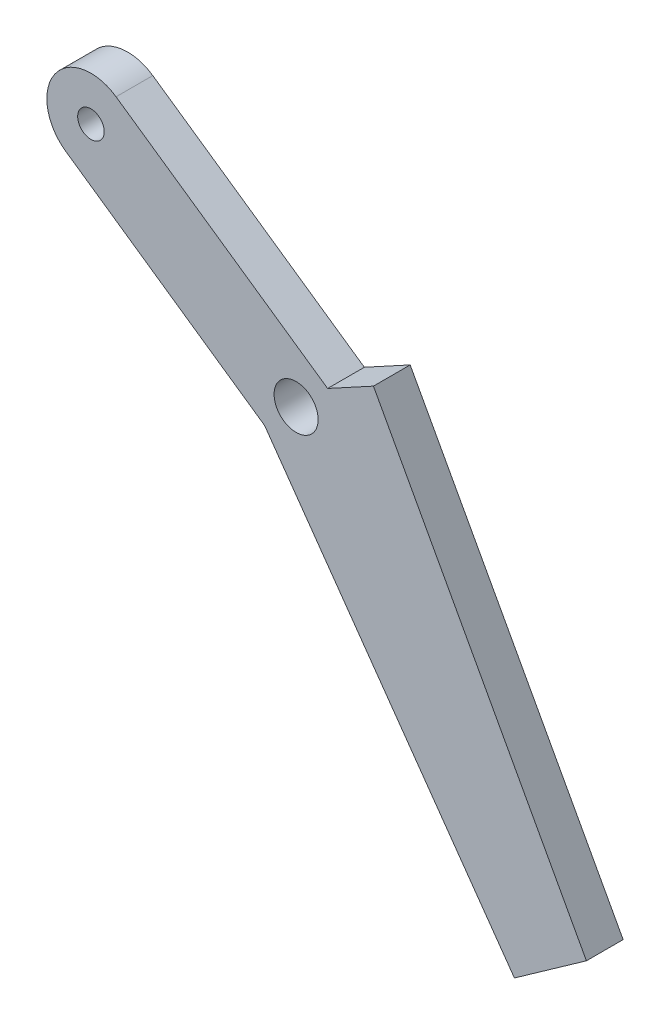
ISO-10303-21;
HEADER;
FILE_DESCRIPTION(('STEP AP214'),'2;1');
FILE_NAME('part.step','',(''),(''),'','','');
FILE_SCHEMA(('AUTOMOTIVE_DESIGN { 1 0 10303 214 1 1 1 1 }'));
ENDSEC;
DATA;
#1=APPLICATION_CONTEXT('core data for automotive mechanical design processes');
#2=APPLICATION_PROTOCOL_DEFINITION('international standard','automotive_design',2000,#1);
#3=PRODUCT_CONTEXT('',#1,'mechanical');
#4=PRODUCT('Part','Part','',(#3));
#5=PRODUCT_RELATED_PRODUCT_CATEGORY('part','',(#4));
#6=PRODUCT_DEFINITION_FORMATION('','',#4);
#7=PRODUCT_DEFINITION_CONTEXT('part definition',#1,'design');
#8=PRODUCT_DEFINITION('design','',#6,#7);
#9=PRODUCT_DEFINITION_SHAPE('','',#8);
#10=(LENGTH_UNIT() NAMED_UNIT(*) SI_UNIT(.MILLI.,.METRE.));
#11=(NAMED_UNIT(*) PLANE_ANGLE_UNIT() SI_UNIT($,.RADIAN.));
#12=(NAMED_UNIT(*) SI_UNIT($,.STERADIAN.) SOLID_ANGLE_UNIT());
#13=UNCERTAINTY_MEASURE_WITH_UNIT(LENGTH_MEASURE(1.E-05),#10,'distance_accuracy_value','');
#14=(GEOMETRIC_REPRESENTATION_CONTEXT(3) GLOBAL_UNCERTAINTY_ASSIGNED_CONTEXT((#13)) GLOBAL_UNIT_ASSIGNED_CONTEXT((#10,
#11,#12)) REPRESENTATION_CONTEXT('',''));
#15=CARTESIAN_POINT('',(0.,0.,0.));
#16=DIRECTION('',(0.,0.,1.));
#17=DIRECTION('',(1.,0.,0.));
#18=AXIS2_PLACEMENT_3D('',#15,#16,#17);
#19=CARTESIAN_POINT('',(36.7403272001533,52.945063432731,-2.5));
#20=DIRECTION('',(0.570112302985173,0.821566772687979,0.));
#21=DIRECTION('',(-0.821566772687979,0.570112302985173,0.));
#22=AXIS2_PLACEMENT_3D('',#19,#20,#21);
#23=PLANE('',#22);
#24=DIRECTION('',(0.821566772687979,-0.570112302985173,0.));
#25=VECTOR('',#24,1.);
#26=CARTESIAN_POINT('',(36.7403272001533,52.945063432731,0.));
#27=LINE('',#26,#25);
#28=CARTESIAN_POINT('',(176.598168195802,-44.1069090559931,0.));
#29=VERTEX_POINT('',#28);
#30=CARTESIAN_POINT('',(190.999396496933,-54.1003967498914,0.));
#31=VERTEX_POINT('',#30);
#32=EDGE_CURVE('E132',#29,#31,#27,.T.);
#33=ORIENTED_EDGE('',*,*,#32,.T.);
#34=DIRECTION('',(0.,0.,1.));
#35=VECTOR('',#34,1.);
#36=CARTESIAN_POINT('',(190.999396496933,-54.1003967498914,-2.5));
#37=LINE('',#36,#35);
#38=CARTESIAN_POINT('',(190.999396496933,-54.1003967498914,-2.5));
#39=VERTEX_POINT('',#38);
#40=EDGE_CURVE('E128',#39,#31,#37,.T.);
#41=ORIENTED_EDGE('',*,*,#40,.F.);
#42=DIRECTION('',(0.821566772687979,-0.570112302985173,0.));
#43=VECTOR('',#42,1.);
#44=CARTESIAN_POINT('',(36.7403272001533,52.945063432731,-2.5));
#45=LINE('',#44,#43);
#46=CARTESIAN_POINT('',(176.598168195802,-44.1069090559931,-2.5));
#47=VERTEX_POINT('',#46);
#48=EDGE_CURVE('E168',#47,#39,#45,.T.);
#49=ORIENTED_EDGE('',*,*,#48,.F.);
#50=DIRECTION('',(0.,0.,1.));
#51=VECTOR('',#50,1.);
#52=CARTESIAN_POINT('',(176.598168195802,-44.1069090559931,-2.5));
#53=LINE('',#52,#51);
#54=EDGE_CURVE('E11',#47,#29,#53,.T.);
#55=ORIENTED_EDGE('',*,*,#54,.T.);
#56=EDGE_LOOP('',(#33,#41,#49,#55));
#57=FACE_BOUND('',#56,.T.);
#58=ADVANCED_FACE('F34',(#57),#23,.T.);
#59=CARTESIAN_POINT('',(174.887831286847,-46.571609374057,-2.5));
#60=DIRECTION('',(0.,0.,1.));
#61=DIRECTION('',(-1.,0.,0.));
#62=AXIS2_PLACEMENT_3D('',#59,#60,#61);
#63=CYLINDRICAL_SURFACE('',#62,2.99999999999999);
#64=CARTESIAN_POINT('',(174.887831286847,-46.571609374057,0.));
#65=DIRECTION('',(0.,0.,1.));
#66=DIRECTION('',(1.,0.,0.));
#67=AXIS2_PLACEMENT_3D('',#64,#65,#66);
#68=CIRCLE('',#67,2.99999999999999);
#69=CARTESIAN_POINT('',(173.177494377891,-49.036309692121,0.));
#70=VERTEX_POINT('',#69);
#71=EDGE_CURVE('E135',#29,#70,#68,.T.);
#72=ORIENTED_EDGE('',*,*,#71,.F.);
#73=ORIENTED_EDGE('',*,*,#54,.F.);
#74=CARTESIAN_POINT('',(174.887831286847,-46.571609374057,-2.5));
#75=DIRECTION('',(0.,0.,1.));
#76=DIRECTION('',(1.,0.,0.));
#77=AXIS2_PLACEMENT_3D('',#74,#75,#76);
#78=CIRCLE('',#77,2.99999999999999);
#79=CARTESIAN_POINT('',(173.177494377891,-49.036309692121,-2.5));
#80=VERTEX_POINT('',#79);
#81=EDGE_CURVE('E86',#47,#80,#78,.T.);
#82=ORIENTED_EDGE('',*,*,#81,.T.);
#83=DIRECTION('',(0.,0.,1.));
#84=VECTOR('',#83,1.);
#85=CARTESIAN_POINT('',(173.177494377891,-49.036309692121,-2.5));
#86=LINE('',#85,#84);
#87=EDGE_CURVE('E43',#80,#70,#86,.T.);
#88=ORIENTED_EDGE('',*,*,#87,.T.);
#89=EDGE_LOOP('',(#72,#73,#82,#88));
#90=FACE_BOUND('',#89,.T.);
#91=ADVANCED_FACE('F160',(#90),#63,.T.);
#92=CARTESIAN_POINT('',(33.3196533822423,48.0156627966031,-2.5));
#93=DIRECTION('',(0.570112302985173,0.821566772687979,0.));
#94=DIRECTION('',(-0.821566772687979,0.570112302985173,0.));
#95=AXIS2_PLACEMENT_3D('',#92,#93,#94);
#96=PLANE('',#95);
#97=DIRECTION('',(0.82156677268798,-0.570112302985173,0.));
#98=VECTOR('',#97,1.);
#99=CARTESIAN_POINT('',(33.3196533822423,48.0156627966031,0.));
#100=LINE('',#99,#98);
#101=CARTESIAN_POINT('',(186.709536348152,-58.4266402997185,0.));
#102=VERTEX_POINT('',#101);
#103=EDGE_CURVE('E138',#70,#102,#100,.T.);
#104=ORIENTED_EDGE('',*,*,#103,.F.);
#105=ORIENTED_EDGE('',*,*,#87,.F.);
#106=DIRECTION('',(0.82156677268798,-0.570112302985173,0.));
#107=VECTOR('',#106,1.);
#108=CARTESIAN_POINT('',(33.3196533822423,48.0156627966031,-2.5));
#109=LINE('',#108,#107);
#110=CARTESIAN_POINT('',(186.709536348152,-58.4266402997185,-2.5));
#111=VERTEX_POINT('',#110);
#112=EDGE_CURVE('E120',#80,#111,#109,.T.);
#113=ORIENTED_EDGE('',*,*,#112,.T.);
#114=DIRECTION('',(0.,0.,1.));
#115=VECTOR('',#114,1.);
#116=CARTESIAN_POINT('',(186.709536348152,-58.4266402997185,-2.5));
#117=LINE('',#116,#115);
#118=EDGE_CURVE('E155',#111,#102,#117,.T.);
#119=ORIENTED_EDGE('',*,*,#118,.T.);
#120=EDGE_LOOP('',(#104,#105,#113,#119));
#121=FACE_BOUND('',#120,.T.);
#122=ADVANCED_FACE('F173',(#121),#96,.F.);
#123=CARTESIAN_POINT('',(97.0070354424607,68.5373410183082,-2.5));
#124=DIRECTION('',(0.816722709480777,0.577030342199072,0.));
#125=DIRECTION('',(-0.577030342199072,0.816722709480777,0.));
#126=AXIS2_PLACEMENT_3D('',#123,#124,#125);
#127=PLANE('',#126);
#128=DIRECTION('',(0.577030342199073,-0.816722709480777,0.));
#129=VECTOR('',#128,1.);
#130=CARTESIAN_POINT('',(97.0070354424607,68.5373410183082,0.));
#131=LINE('',#130,#129);
#132=CARTESIAN_POINT('',(203.715208560072,-82.4962908358255,0.));
#133=VERTEX_POINT('',#132);
#134=EDGE_CURVE('E141',#102,#133,#131,.T.);
#135=ORIENTED_EDGE('',*,*,#134,.F.);
#136=ORIENTED_EDGE('',*,*,#118,.F.);
#137=DIRECTION('',(0.577030342199073,-0.816722709480777,0.));
#138=VECTOR('',#137,1.);
#139=CARTESIAN_POINT('',(97.0070354424607,68.5373410183082,-2.5));
#140=LINE('',#139,#138);
#141=CARTESIAN_POINT('',(203.715208560072,-82.4962908358255,-2.5));
#142=VERTEX_POINT('',#141);
#143=EDGE_CURVE('E118',#111,#142,#140,.T.);
#144=ORIENTED_EDGE('',*,*,#143,.T.);
#145=DIRECTION('',(0.,0.,1.));
#146=VECTOR('',#145,1.);
#147=CARTESIAN_POINT('',(203.715208560072,-82.4962908358255,-2.5));
#148=LINE('',#147,#146);
#149=EDGE_CURVE('E112',#142,#133,#148,.T.);
#150=ORIENTED_EDGE('',*,*,#149,.T.);
#151=EDGE_LOOP('',(#135,#136,#144,#150));
#152=FACE_BOUND('',#151,.T.);
#153=ADVANCED_FACE('F176',(#152),#127,.F.);
#154=CARTESIAN_POINT('',(106.708173117611,-151.033631854134,-2.5));
#155=DIRECTION('',(-0.57703034219907,0.816722709480779,0.));
#156=DIRECTION('',(-0.816722709480779,-0.57703034219907,0.));
#157=AXIS2_PLACEMENT_3D('',#154,#155,#156);
#158=PLANE('',#157);
#159=DIRECTION('',(0.816722709480779,0.57703034219907,0.));
#160=VECTOR('',#159,1.);
#161=CARTESIAN_POINT('',(106.708173117611,-151.033631854134,0.));
#162=LINE('',#161,#160);
#163=CARTESIAN_POINT('',(208.615544816957,-79.0341087826311,0.));
#164=VERTEX_POINT('',#163);
#165=EDGE_CURVE('E144',#133,#164,#162,.T.);
#166=ORIENTED_EDGE('',*,*,#165,.F.);
#167=ORIENTED_EDGE('',*,*,#149,.F.);
#168=DIRECTION('',(0.816722709480779,0.57703034219907,0.));
#169=VECTOR('',#168,1.);
#170=CARTESIAN_POINT('',(106.708173117611,-151.033631854134,-2.5));
#171=LINE('',#170,#169);
#172=CARTESIAN_POINT('',(208.615544816957,-79.0341087826311,-2.5));
#173=VERTEX_POINT('',#172);
#174=EDGE_CURVE('E102',#142,#173,#171,.T.);
#175=ORIENTED_EDGE('',*,*,#174,.T.);
#176=DIRECTION('',(0.,0.,1.));
#177=VECTOR('',#176,1.);
#178=CARTESIAN_POINT('',(208.615544816957,-79.0341087826311,-2.5));
#179=LINE('',#178,#177);
#180=EDGE_CURVE('E107',#173,#164,#179,.T.);
#181=ORIENTED_EDGE('',*,*,#180,.T.);
#182=EDGE_LOOP('',(#166,#167,#175,#181));
#183=FACE_BOUND('',#182,.T.);
#184=ADVANCED_FACE('F115',(#183),#158,.F.);
#185=CARTESIAN_POINT('',(127.740995685432,69.5361116307564,-2.5));
#186=DIRECTION('',(-0.878302210072713,-0.478105875075163,0.));
#187=DIRECTION('',(0.478105875075163,-0.878302210072713,0.));
#188=AXIS2_PLACEMENT_3D('',#185,#186,#187);
#189=PLANE('',#188);
#190=DIRECTION('',(-0.478105875075163,0.878302210072713,0.));
#191=VECTOR('',#190,1.);
#192=CARTESIAN_POINT('',(127.740995685432,69.5361116307564,0.));
#193=LINE('',#192,#191);
#194=CARTESIAN_POINT('',(194.118553111525,-52.4024765060244,0.));
#195=VERTEX_POINT('',#194);
#196=EDGE_CURVE('E109',#164,#195,#193,.T.);
#197=ORIENTED_EDGE('',*,*,#196,.F.);
#198=ORIENTED_EDGE('',*,*,#180,.F.);
#199=DIRECTION('',(-0.478105875075163,0.878302210072713,0.));
#200=VECTOR('',#199,1.);
#201=CARTESIAN_POINT('',(127.740995685432,69.5361116307564,-2.5));
#202=LINE('',#201,#200);
#203=CARTESIAN_POINT('',(194.118553111525,-52.4024765060244,-2.5));
#204=VERTEX_POINT('',#203);
#205=EDGE_CURVE('E97',#173,#204,#202,.T.);
#206=ORIENTED_EDGE('',*,*,#205,.T.);
#207=DIRECTION('',(0.,0.,1.));
#208=VECTOR('',#207,1.);
#209=CARTESIAN_POINT('',(194.118553111525,-52.4024765060244,-2.5));
#210=LINE('',#209,#208);
#211=EDGE_CURVE('E113',#204,#195,#210,.T.);
#212=ORIENTED_EDGE('',*,*,#211,.T.);
#213=EDGE_LOOP('',(#197,#198,#206,#212));
#214=FACE_BOUND('',#213,.T.);
#215=ADVANCED_FACE('F108',(#214),#189,.F.);
#216=CARTESIAN_POINT('',(66.3775574260927,-121.938588136781,-2.5));
#217=DIRECTION('',(-0.478105875075164,0.878302210072713,0.));
#218=DIRECTION('',(-0.878302210072713,-0.478105875075164,0.));
#219=AXIS2_PLACEMENT_3D('',#216,#217,#218);
#220=PLANE('',#219);
#221=DIRECTION('',(0.878302210072713,0.478105875075164,0.));
#222=VECTOR('',#221,1.);
#223=CARTESIAN_POINT('',(66.3775574260927,-121.938588136781,0.));
#224=LINE('',#223,#222);
#225=EDGE_CURVE('E74',#31,#195,#224,.T.);
#226=ORIENTED_EDGE('',*,*,#225,.T.);
#227=ORIENTED_EDGE('',*,*,#211,.F.);
#228=DIRECTION('',(0.878302210072713,0.478105875075164,0.));
#229=VECTOR('',#228,1.);
#230=CARTESIAN_POINT('',(66.3775574260927,-121.938588136781,-2.5));
#231=LINE('',#230,#229);
#232=EDGE_CURVE('E51',#39,#204,#231,.T.);
#233=ORIENTED_EDGE('',*,*,#232,.F.);
#234=ORIENTED_EDGE('',*,*,#40,.T.);
#235=EDGE_LOOP('',(#226,#227,#233,#234));
#236=FACE_BOUND('',#235,.T.);
#237=ADVANCED_FACE('F215',(#236),#220,.T.);
#238=CARTESIAN_POINT('',(188.854466422543,-56.263518524805,-2.5));
#239=DIRECTION('',(0.,0.,1.));
#240=DIRECTION('',(-1.,0.,0.));
#241=AXIS2_PLACEMENT_3D('',#238,#239,#240);
#242=CYLINDRICAL_SURFACE('',#241,1.5);
#243=CARTESIAN_POINT('',(188.854466422543,-56.263518524805,-2.5));
#244=DIRECTION('',(0.,0.,1.));
#245=DIRECTION('',(1.,0.,0.));
#246=AXIS2_PLACEMENT_3D('',#243,#244,#245);
#247=CIRCLE('',#246,1.5);
#248=CARTESIAN_POINT('',(190.354466422543,-56.263518524805,-2.5));
#249=VERTEX_POINT('',#248);
#250=EDGE_CURVE('E151',#249,#249,#247,.T.);
#251=ORIENTED_EDGE('',*,*,#250,.F.);
#252=EDGE_LOOP('',(#251));
#253=FACE_BOUND('',#252,.T.);
#254=CARTESIAN_POINT('',(188.854466422543,-56.263518524805,0.));
#255=DIRECTION('',(0.,0.,1.));
#256=DIRECTION('',(1.,0.,0.));
#257=AXIS2_PLACEMENT_3D('',#254,#255,#256);
#258=CIRCLE('',#257,1.5);
#259=CARTESIAN_POINT('',(190.354466422543,-56.263518524805,0.));
#260=VERTEX_POINT('',#259);
#261=EDGE_CURVE('E129',#260,#260,#258,.T.);
#262=ORIENTED_EDGE('',*,*,#261,.T.);
#263=EDGE_LOOP('',(#262));
#264=FACE_BOUND('',#263,.T.);
#265=ADVANCED_FACE('F36',(#253,#264),#242,.F.);
#266=CARTESIAN_POINT('',(174.887831286847,-46.571609374057,-2.5));
#267=DIRECTION('',(0.,0.,1.));
#268=DIRECTION('',(-1.,0.,0.));
#269=AXIS2_PLACEMENT_3D('',#266,#267,#268);
#270=CYLINDRICAL_SURFACE('',#269,0.901496021214135);
#271=CARTESIAN_POINT('',(174.887831286847,-46.571609374057,-2.5));
#272=DIRECTION('',(0.,0.,1.));
#273=DIRECTION('',(1.,0.,0.));
#274=AXIS2_PLACEMENT_3D('',#271,#272,#273);
#275=CIRCLE('',#274,0.901496021214135);
#276=CARTESIAN_POINT('',(175.789327308061,-46.571609374057,-2.5));
#277=VERTEX_POINT('',#276);
#278=EDGE_CURVE('E125',#277,#277,#275,.T.);
#279=ORIENTED_EDGE('',*,*,#278,.F.);
#280=EDGE_LOOP('',(#279));
#281=FACE_BOUND('',#280,.T.);
#282=CARTESIAN_POINT('',(174.887831286847,-46.571609374057,0.));
#283=DIRECTION('',(0.,0.,1.));
#284=DIRECTION('',(1.,0.,0.));
#285=AXIS2_PLACEMENT_3D('',#282,#283,#284);
#286=CIRCLE('',#285,0.901496021214135);
#287=CARTESIAN_POINT('',(175.789327308061,-46.571609374057,0.));
#288=VERTEX_POINT('',#287);
#289=EDGE_CURVE('E148',#288,#288,#286,.T.);
#290=ORIENTED_EDGE('',*,*,#289,.T.);
#291=EDGE_LOOP('',(#290));
#292=FACE_BOUND('',#291,.T.);
#293=ADVANCED_FACE('F232',(#281,#292),#270,.F.);
#294=CARTESIAN_POINT('',(0.,0.,-2.5));
#295=DIRECTION('',(0.,0.,-1.));
#296=DIRECTION('',(1.,0.,0.));
#297=AXIS2_PLACEMENT_3D('',#294,#295,#296);
#298=PLANE('',#297);
#299=ORIENTED_EDGE('',*,*,#250,.T.);
#300=EDGE_LOOP('',(#299));
#301=FACE_BOUND('',#300,.T.);
#302=ORIENTED_EDGE('',*,*,#48,.T.);
#303=ORIENTED_EDGE('',*,*,#232,.T.);
#304=ORIENTED_EDGE('',*,*,#205,.F.);
#305=ORIENTED_EDGE('',*,*,#174,.F.);
#306=ORIENTED_EDGE('',*,*,#143,.F.);
#307=ORIENTED_EDGE('',*,*,#112,.F.);
#308=ORIENTED_EDGE('',*,*,#81,.F.);
#309=EDGE_LOOP('',(#302,#303,#304,#305,#306,#307,#308));
#310=FACE_BOUND('',#309,.T.);
#311=ORIENTED_EDGE('',*,*,#278,.T.);
#312=EDGE_LOOP('',(#311));
#313=FACE_BOUND('',#312,.T.);
#314=ADVANCED_FACE('F99',(#301,#310,#313),#298,.T.);
#315=CARTESIAN_POINT('',(0.,0.,0.));
#316=DIRECTION('',(0.,0.,-1.));
#317=DIRECTION('',(1.,0.,0.));
#318=AXIS2_PLACEMENT_3D('',#315,#316,#317);
#319=PLANE('',#318);
#320=ORIENTED_EDGE('',*,*,#261,.F.);
#321=EDGE_LOOP('',(#320));
#322=FACE_BOUND('',#321,.T.);
#323=ORIENTED_EDGE('',*,*,#32,.F.);
#324=ORIENTED_EDGE('',*,*,#71,.T.);
#325=ORIENTED_EDGE('',*,*,#103,.T.);
#326=ORIENTED_EDGE('',*,*,#134,.T.);
#327=ORIENTED_EDGE('',*,*,#165,.T.);
#328=ORIENTED_EDGE('',*,*,#196,.T.);
#329=ORIENTED_EDGE('',*,*,#225,.F.);
#330=EDGE_LOOP('',(#323,#324,#325,#326,#327,#328,#329));
#331=FACE_BOUND('',#330,.T.);
#332=ORIENTED_EDGE('',*,*,#289,.F.);
#333=EDGE_LOOP('',(#332));
#334=FACE_BOUND('',#333,.T.);
#335=ADVANCED_FACE('F163',(#322,#331,#334),#319,.F.);
#336=CLOSED_SHELL('',(#58,#91,#122,#153,#184,#215,#237,#265,#293,#314,#335));
#337=MANIFOLD_SOLID_BREP('B2',#336);
#338=ADVANCED_BREP_SHAPE_REPRESENTATION('',(#18,#337),#14);
#339=SHAPE_DEFINITION_REPRESENTATION(#9,#338);
ENDSEC;
END-ISO-10303-21;
